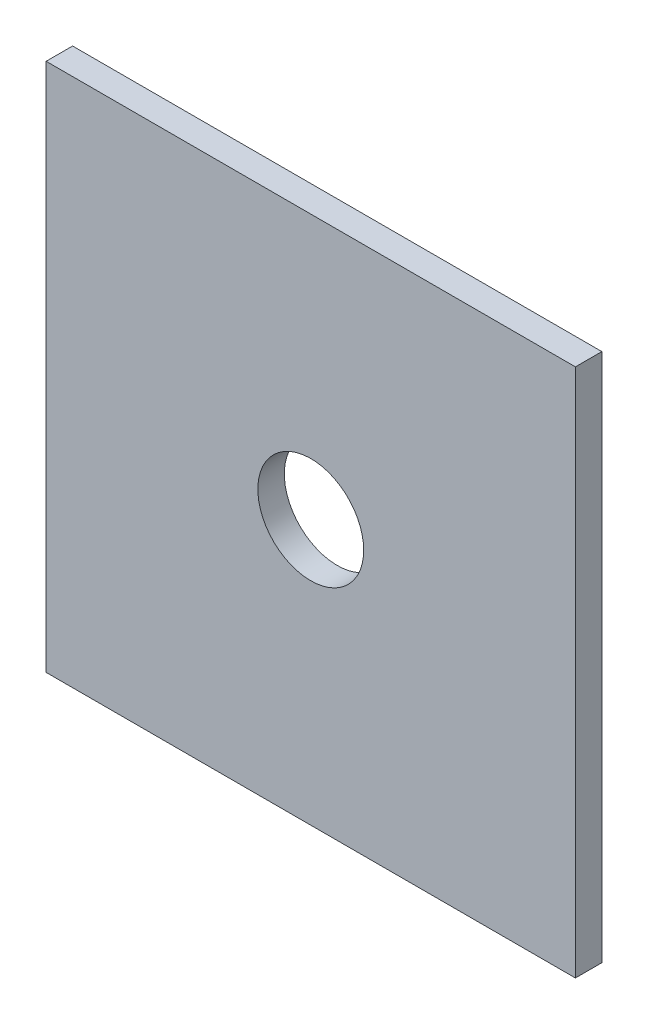
ISO-10303-21;
HEADER;
FILE_DESCRIPTION(('STEP AP214'),'2;1');
FILE_NAME('part.step','',(''),(''),'','','');
FILE_SCHEMA(('AUTOMOTIVE_DESIGN { 1 0 10303 214 1 1 1 1 }'));
ENDSEC;
DATA;
#1=APPLICATION_CONTEXT('core data for automotive mechanical design processes');
#2=APPLICATION_PROTOCOL_DEFINITION('international standard','automotive_design',2000,#1);
#3=PRODUCT_CONTEXT('',#1,'mechanical');
#4=PRODUCT('Part','Part','',(#3));
#5=PRODUCT_RELATED_PRODUCT_CATEGORY('part','',(#4));
#6=PRODUCT_DEFINITION_FORMATION('','',#4);
#7=PRODUCT_DEFINITION_CONTEXT('part definition',#1,'design');
#8=PRODUCT_DEFINITION('design','',#6,#7);
#9=PRODUCT_DEFINITION_SHAPE('','',#8);
#10=(LENGTH_UNIT() NAMED_UNIT(*) SI_UNIT(.MILLI.,.METRE.));
#11=(NAMED_UNIT(*) PLANE_ANGLE_UNIT() SI_UNIT($,.RADIAN.));
#12=(NAMED_UNIT(*) SI_UNIT($,.STERADIAN.) SOLID_ANGLE_UNIT());
#13=UNCERTAINTY_MEASURE_WITH_UNIT(LENGTH_MEASURE(1.E-05),#10,'distance_accuracy_value','');
#14=(GEOMETRIC_REPRESENTATION_CONTEXT(3) GLOBAL_UNCERTAINTY_ASSIGNED_CONTEXT((#13)) GLOBAL_UNIT_ASSIGNED_CONTEXT((#10,
#11,#12)) REPRESENTATION_CONTEXT('',''));
#15=CARTESIAN_POINT('',(0.,0.,0.));
#16=DIRECTION('',(0.,0.,1.));
#17=DIRECTION('',(1.,0.,0.));
#18=AXIS2_PLACEMENT_3D('',#15,#16,#17);
#19=CARTESIAN_POINT('',(20.,-20.,1.));
#20=DIRECTION('',(-1.,0.,0.));
#21=DIRECTION('',(0.,-1.,0.));
#22=AXIS2_PLACEMENT_3D('',#19,#20,#21);
#23=PLANE('',#22);
#24=DIRECTION('',(0.,1.,0.));
#25=VECTOR('',#24,1.);
#26=CARTESIAN_POINT('',(20.,-20.,-1.));
#27=LINE('',#26,#25);
#28=CARTESIAN_POINT('',(20.,-20.,-1.));
#29=VERTEX_POINT('',#28);
#30=CARTESIAN_POINT('',(20.,20.,-1.));
#31=VERTEX_POINT('',#30);
#32=EDGE_CURVE('E96',#29,#31,#27,.T.);
#33=ORIENTED_EDGE('',*,*,#32,.T.);
#34=DIRECTION('',(0.,0.,-1.));
#35=VECTOR('',#34,1.);
#36=CARTESIAN_POINT('',(20.,20.,1.));
#37=LINE('',#36,#35);
#38=CARTESIAN_POINT('',(20.,20.,1.));
#39=VERTEX_POINT('',#38);
#40=EDGE_CURVE('E11',#39,#31,#37,.T.);
#41=ORIENTED_EDGE('',*,*,#40,.F.);
#42=DIRECTION('',(0.,1.,0.));
#43=VECTOR('',#42,1.);
#44=CARTESIAN_POINT('',(20.,-20.,1.));
#45=LINE('',#44,#43);
#46=CARTESIAN_POINT('',(20.,-20.,1.));
#47=VERTEX_POINT('',#46);
#48=EDGE_CURVE('E84',#47,#39,#45,.T.);
#49=ORIENTED_EDGE('',*,*,#48,.F.);
#50=DIRECTION('',(0.,0.,-1.));
#51=VECTOR('',#50,1.);
#52=CARTESIAN_POINT('',(20.,-20.,1.));
#53=LINE('',#52,#51);
#54=EDGE_CURVE('E92',#47,#29,#53,.T.);
#55=ORIENTED_EDGE('',*,*,#54,.T.);
#56=EDGE_LOOP('',(#33,#41,#49,#55));
#57=FACE_BOUND('',#56,.T.);
#58=ADVANCED_FACE('F33',(#57),#23,.F.);
#59=CARTESIAN_POINT('',(-20.,20.,1.));
#60=DIRECTION('',(0.,-1.,0.));
#61=DIRECTION('',(0.,0.,-1.));
#62=AXIS2_PLACEMENT_3D('',#59,#60,#61);
#63=PLANE('',#62);
#64=DIRECTION('',(-1.,0.,0.));
#65=VECTOR('',#64,1.);
#66=CARTESIAN_POINT('',(-20.,20.,-1.));
#67=LINE('',#66,#65);
#68=CARTESIAN_POINT('',(-20.,20.,-1.));
#69=VERTEX_POINT('',#68);
#70=EDGE_CURVE('E88',#31,#69,#67,.T.);
#71=ORIENTED_EDGE('',*,*,#70,.T.);
#72=DIRECTION('',(0.,0.,-1.));
#73=VECTOR('',#72,1.);
#74=CARTESIAN_POINT('',(-20.,20.,1.));
#75=LINE('',#74,#73);
#76=CARTESIAN_POINT('',(-20.,20.,1.));
#77=VERTEX_POINT('',#76);
#78=EDGE_CURVE('E41',#77,#69,#75,.T.);
#79=ORIENTED_EDGE('',*,*,#78,.F.);
#80=DIRECTION('',(-1.,0.,0.));
#81=VECTOR('',#80,1.);
#82=CARTESIAN_POINT('',(-20.,20.,1.));
#83=LINE('',#82,#81);
#84=EDGE_CURVE('E79',#39,#77,#83,.T.);
#85=ORIENTED_EDGE('',*,*,#84,.F.);
#86=ORIENTED_EDGE('',*,*,#40,.T.);
#87=EDGE_LOOP('',(#71,#79,#85,#86));
#88=FACE_BOUND('',#87,.T.);
#89=ADVANCED_FACE('F87',(#88),#63,.F.);
#90=CARTESIAN_POINT('',(-20.,-20.,1.));
#91=DIRECTION('',(1.,0.,0.));
#92=DIRECTION('',(0.,1.,0.));
#93=AXIS2_PLACEMENT_3D('',#90,#91,#92);
#94=PLANE('',#93);
#95=DIRECTION('',(0.,-1.,0.));
#96=VECTOR('',#95,1.);
#97=CARTESIAN_POINT('',(-20.,-20.,-1.));
#98=LINE('',#97,#96);
#99=CARTESIAN_POINT('',(-20.,-20.,-1.));
#100=VERTEX_POINT('',#99);
#101=EDGE_CURVE('E66',#69,#100,#98,.T.);
#102=ORIENTED_EDGE('',*,*,#101,.T.);
#103=DIRECTION('',(0.,0.,-1.));
#104=VECTOR('',#103,1.);
#105=CARTESIAN_POINT('',(-20.,-20.,1.));
#106=LINE('',#105,#104);
#107=CARTESIAN_POINT('',(-20.,-20.,1.));
#108=VERTEX_POINT('',#107);
#109=EDGE_CURVE('E89',#108,#100,#106,.T.);
#110=ORIENTED_EDGE('',*,*,#109,.F.);
#111=DIRECTION('',(0.,-1.,0.));
#112=VECTOR('',#111,1.);
#113=CARTESIAN_POINT('',(-20.,-20.,1.));
#114=LINE('',#113,#112);
#115=EDGE_CURVE('E82',#77,#108,#114,.T.);
#116=ORIENTED_EDGE('',*,*,#115,.F.);
#117=ORIENTED_EDGE('',*,*,#78,.T.);
#118=EDGE_LOOP('',(#102,#110,#116,#117));
#119=FACE_BOUND('',#118,.T.);
#120=ADVANCED_FACE('F90',(#119),#94,.F.);
#121=CARTESIAN_POINT('',(-20.,-20.,1.));
#122=DIRECTION('',(0.,1.,0.));
#123=DIRECTION('',(0.,0.,1.));
#124=AXIS2_PLACEMENT_3D('',#121,#122,#123);
#125=PLANE('',#124);
#126=DIRECTION('',(1.,0.,0.));
#127=VECTOR('',#126,1.);
#128=CARTESIAN_POINT('',(-20.,-20.,-1.));
#129=LINE('',#128,#127);
#130=EDGE_CURVE('E72',#100,#29,#129,.T.);
#131=ORIENTED_EDGE('',*,*,#130,.T.);
#132=ORIENTED_EDGE('',*,*,#54,.F.);
#133=DIRECTION('',(1.,0.,0.));
#134=VECTOR('',#133,1.);
#135=CARTESIAN_POINT('',(-20.,-20.,1.));
#136=LINE('',#135,#134);
#137=EDGE_CURVE('E49',#108,#47,#136,.T.);
#138=ORIENTED_EDGE('',*,*,#137,.F.);
#139=ORIENTED_EDGE('',*,*,#109,.T.);
#140=EDGE_LOOP('',(#131,#132,#138,#139));
#141=FACE_BOUND('',#140,.T.);
#142=ADVANCED_FACE('F104',(#141),#125,.F.);
#143=CARTESIAN_POINT('',(0.,0.,1.));
#144=DIRECTION('',(0.,0.,-1.));
#145=DIRECTION('',(-1.,0.,0.));
#146=AXIS2_PLACEMENT_3D('',#143,#144,#145);
#147=PLANE('',#146);
#148=CARTESIAN_POINT('',(0.,0.,1.));
#149=DIRECTION('',(0.,0.,1.));
#150=DIRECTION('',(1.,0.,0.));
#151=AXIS2_PLACEMENT_3D('',#148,#149,#150);
#152=CIRCLE('',#151,4.);
#153=CARTESIAN_POINT('',(4.,0.,1.));
#154=VERTEX_POINT('',#153);
#155=EDGE_CURVE('E110',#154,#154,#152,.T.);
#156=ORIENTED_EDGE('',*,*,#155,.F.);
#157=EDGE_LOOP('',(#156));
#158=FACE_BOUND('',#157,.T.);
#159=ORIENTED_EDGE('',*,*,#48,.T.);
#160=ORIENTED_EDGE('',*,*,#84,.T.);
#161=ORIENTED_EDGE('',*,*,#115,.T.);
#162=ORIENTED_EDGE('',*,*,#137,.T.);
#163=EDGE_LOOP('',(#159,#160,#161,#162));
#164=FACE_BOUND('',#163,.T.);
#165=ADVANCED_FACE('F80',(#158,#164),#147,.F.);
#166=CARTESIAN_POINT('',(0.,0.,-1.));
#167=DIRECTION('',(0.,0.,-1.));
#168=DIRECTION('',(-1.,0.,0.));
#169=AXIS2_PLACEMENT_3D('',#166,#167,#168);
#170=PLANE('',#169);
#171=CARTESIAN_POINT('',(0.,0.,-1.));
#172=DIRECTION('',(0.,0.,1.));
#173=DIRECTION('',(1.,0.,0.));
#174=AXIS2_PLACEMENT_3D('',#171,#172,#173);
#175=CIRCLE('',#174,4.);
#176=CARTESIAN_POINT('',(4.,0.,-1.));
#177=VERTEX_POINT('',#176);
#178=EDGE_CURVE('E99',#177,#177,#175,.T.);
#179=ORIENTED_EDGE('',*,*,#178,.T.);
#180=EDGE_LOOP('',(#179));
#181=FACE_BOUND('',#180,.T.);
#182=ORIENTED_EDGE('',*,*,#32,.F.);
#183=ORIENTED_EDGE('',*,*,#130,.F.);
#184=ORIENTED_EDGE('',*,*,#101,.F.);
#185=ORIENTED_EDGE('',*,*,#70,.F.);
#186=EDGE_LOOP('',(#182,#183,#184,#185));
#187=FACE_BOUND('',#186,.T.);
#188=ADVANCED_FACE('F107',(#181,#187),#170,.T.);
#189=CARTESIAN_POINT('',(0.,0.,-1.));
#190=DIRECTION('',(0.,0.,1.));
#191=DIRECTION('',(1.,0.,0.));
#192=AXIS2_PLACEMENT_3D('',#189,#190,#191);
#193=CYLINDRICAL_SURFACE('',#192,4.);
#194=ORIENTED_EDGE('',*,*,#178,.F.);
#195=EDGE_LOOP('',(#194));
#196=FACE_BOUND('',#195,.T.);
#197=ORIENTED_EDGE('',*,*,#155,.T.);
#198=EDGE_LOOP('',(#197));
#199=FACE_BOUND('',#198,.T.);
#200=ADVANCED_FACE('F117',(#196,#199),#193,.F.);
#201=CLOSED_SHELL('',(#58,#89,#120,#142,#165,#188,#200));
#202=MANIFOLD_SOLID_BREP('B2',#201);
#203=ADVANCED_BREP_SHAPE_REPRESENTATION('',(#18,#202),#14);
#204=SHAPE_DEFINITION_REPRESENTATION(#9,#203);
ENDSEC;
END-ISO-10303-21;
